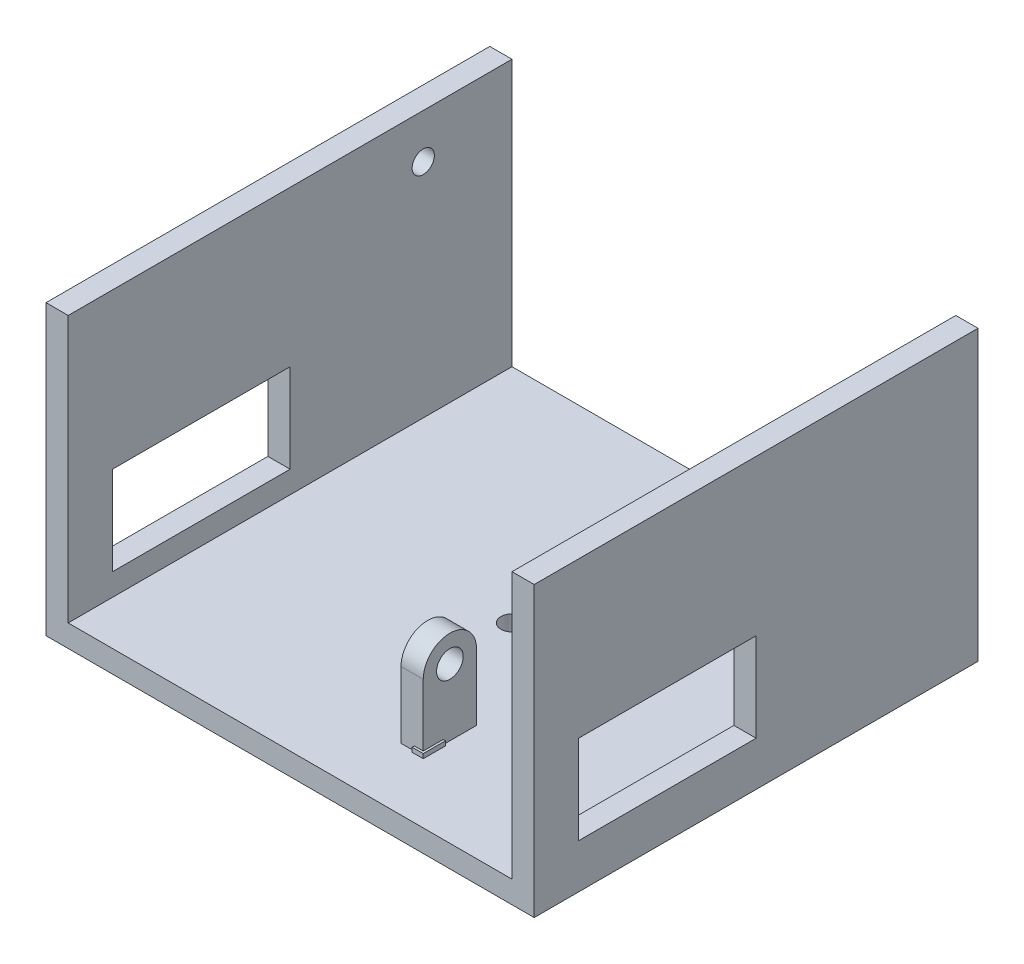
ISO-10303-21;
HEADER;
FILE_DESCRIPTION(('STEP AP214'),'2;1');
FILE_NAME('part.step','',(''),(''),'','','');
FILE_SCHEMA(('AUTOMOTIVE_DESIGN { 1 0 10303 214 1 1 1 1 }'));
ENDSEC;
DATA;
#1=APPLICATION_CONTEXT('core data for automotive mechanical design processes');
#2=APPLICATION_PROTOCOL_DEFINITION('international standard','automotive_design',2000,#1);
#3=PRODUCT_CONTEXT('',#1,'mechanical');
#4=PRODUCT('Part','Part','',(#3));
#5=PRODUCT_RELATED_PRODUCT_CATEGORY('part','',(#4));
#6=PRODUCT_DEFINITION_FORMATION('','',#4);
#7=PRODUCT_DEFINITION_CONTEXT('part definition',#1,'design');
#8=PRODUCT_DEFINITION('design','',#6,#7);
#9=PRODUCT_DEFINITION_SHAPE('','',#8);
#10=(LENGTH_UNIT() NAMED_UNIT(*) SI_UNIT(.MILLI.,.METRE.));
#11=(NAMED_UNIT(*) PLANE_ANGLE_UNIT() SI_UNIT($,.RADIAN.));
#12=(NAMED_UNIT(*) SI_UNIT($,.STERADIAN.) SOLID_ANGLE_UNIT());
#13=UNCERTAINTY_MEASURE_WITH_UNIT(LENGTH_MEASURE(1.E-05),#10,'distance_accuracy_value','');
#14=(GEOMETRIC_REPRESENTATION_CONTEXT(3) GLOBAL_UNCERTAINTY_ASSIGNED_CONTEXT((#13)) GLOBAL_UNIT_ASSIGNED_CONTEXT((#10,
#11,#12)) REPRESENTATION_CONTEXT('',''));
#15=CARTESIAN_POINT('',(0.,0.,0.));
#16=DIRECTION('',(0.,0.,1.));
#17=DIRECTION('',(1.,0.,0.));
#18=AXIS2_PLACEMENT_3D('',#15,#16,#17);
#19=CARTESIAN_POINT('',(-50.,4.99999999999999,100.));
#20=DIRECTION('',(0.,-1.,0.));
#21=DIRECTION('',(0.,0.,-1.));
#22=AXIS2_PLACEMENT_3D('',#19,#20,#21);
#23=PLANE('',#22);
#24=CARTESIAN_POINT('',(0.,4.99999999999999,50.));
#25=DIRECTION('',(0.,1.,0.));
#26=DIRECTION('',(0.,0.,1.));
#27=AXIS2_PLACEMENT_3D('',#24,#25,#26);
#28=CIRCLE('',#27,2.5);
#29=CARTESIAN_POINT('',(0.,4.99999999999999,52.5));
#30=VERTEX_POINT('',#29);
#31=EDGE_CURVE('E392',#30,#30,#28,.T.);
#32=ORIENTED_EDGE('',*,*,#31,.F.);
#33=EDGE_LOOP('',(#32));
#34=FACE_BOUND('',#33,.T.);
#35=CARTESIAN_POINT('',(0.,4.99999999999999,30.));
#36=DIRECTION('',(0.,1.,0.));
#37=DIRECTION('',(0.,0.,-1.));
#38=AXIS2_PLACEMENT_3D('',#35,#36,#37);
#39=CIRCLE('',#38,3.);
#40=CARTESIAN_POINT('',(0.,4.99999999999999,27.));
#41=VERTEX_POINT('',#40);
#42=EDGE_CURVE('E391',#41,#41,#39,.T.);
#43=ORIENTED_EDGE('',*,*,#42,.F.);
#44=EDGE_LOOP('',(#43));
#45=FACE_BOUND('',#44,.T.);
#46=DIRECTION('',(-1.,0.,0.));
#47=VECTOR('',#46,1.);
#48=CARTESIAN_POINT('',(-50.,4.99999999999999,0.));
#49=LINE('',#48,#47);
#50=CARTESIAN_POINT('',(50.,4.99999999999999,0.));
#51=VERTEX_POINT('',#50);
#52=CARTESIAN_POINT('',(-50.,4.99999999999999,0.));
#53=VERTEX_POINT('',#52);
#54=EDGE_CURVE('E437',#51,#53,#49,.T.);
#55=ORIENTED_EDGE('',*,*,#54,.T.);
#56=DIRECTION('',(0.,0.,-1.));
#57=VECTOR('',#56,1.);
#58=CARTESIAN_POINT('',(-50.,4.99999999999999,100.));
#59=LINE('',#58,#57);
#60=CARTESIAN_POINT('',(-50.,4.99999999999999,100.));
#61=VERTEX_POINT('',#60);
#62=EDGE_CURVE('E466',#61,#53,#59,.T.);
#63=ORIENTED_EDGE('',*,*,#62,.F.);
#64=DIRECTION('',(-1.,0.,0.));
#65=VECTOR('',#64,1.);
#66=CARTESIAN_POINT('',(-50.,4.99999999999999,100.));
#67=LINE('',#66,#65);
#68=CARTESIAN_POINT('',(50.,4.99999999999999,100.));
#69=VERTEX_POINT('',#68);
#70=EDGE_CURVE('E411',#69,#61,#67,.T.);
#71=ORIENTED_EDGE('',*,*,#70,.F.);
#72=DIRECTION('',(0.,0.,-1.));
#73=VECTOR('',#72,1.);
#74=CARTESIAN_POINT('',(50.,4.99999999999999,100.));
#75=LINE('',#74,#73);
#76=EDGE_CURVE('E470',#69,#51,#75,.T.);
#77=ORIENTED_EDGE('',*,*,#76,.T.);
#78=EDGE_LOOP('',(#55,#63,#71,#77));
#79=FACE_BOUND('',#78,.T.);
#80=DIRECTION('',(0.,0.,1.));
#81=VECTOR('',#80,1.);
#82=CARTESIAN_POINT('',(14.,4.99999999999999,86.));
#83=LINE('',#82,#81);
#84=CARTESIAN_POINT('',(14.,4.99999999999999,86.));
#85=VERTEX_POINT('',#84);
#86=CARTESIAN_POINT('',(14.,4.99999999999999,86.5));
#87=VERTEX_POINT('',#86);
#88=EDGE_CURVE('E238',#85,#87,#83,.T.);
#89=ORIENTED_EDGE('',*,*,#88,.F.);
#90=DIRECTION('',(1.,0.,0.));
#91=VECTOR('',#90,1.);
#92=CARTESIAN_POINT('',(11.,4.99999999999999,86.));
#93=LINE('',#92,#91);
#94=CARTESIAN_POINT('',(11.,4.99999999999999,86.));
#95=VERTEX_POINT('',#94);
#96=EDGE_CURVE('E268',#95,#85,#93,.T.);
#97=ORIENTED_EDGE('',*,*,#96,.F.);
#98=DIRECTION('',(0.,0.,1.));
#99=VECTOR('',#98,1.);
#100=CARTESIAN_POINT('',(11.,4.99999999999999,74.));
#101=LINE('',#100,#99);
#102=CARTESIAN_POINT('',(11.,4.99999999999999,74.));
#103=VERTEX_POINT('',#102);
#104=EDGE_CURVE('E279',#103,#95,#101,.T.);
#105=ORIENTED_EDGE('',*,*,#104,.F.);
#106=DIRECTION('',(-1.,0.,0.));
#107=VECTOR('',#106,1.);
#108=CARTESIAN_POINT('',(11.,4.99999999999999,74.));
#109=LINE('',#108,#107);
#110=CARTESIAN_POINT('',(16.,4.99999999999999,74.));
#111=VERTEX_POINT('',#110);
#112=EDGE_CURVE('E275',#111,#103,#109,.T.);
#113=ORIENTED_EDGE('',*,*,#112,.F.);
#114=DIRECTION('',(0.,0.,-1.));
#115=VECTOR('',#114,1.);
#116=CARTESIAN_POINT('',(16.,4.99999999999999,74.));
#117=LINE('',#116,#115);
#118=CARTESIAN_POINT('',(16.,4.99999999999999,81.5));
#119=VERTEX_POINT('',#118);
#120=EDGE_CURVE('E71',#119,#111,#117,.T.);
#121=ORIENTED_EDGE('',*,*,#120,.F.);
#122=DIRECTION('',(-1.,0.,0.));
#123=VECTOR('',#122,1.);
#124=CARTESIAN_POINT('',(16.5,4.99999999999999,81.5));
#125=LINE('',#124,#123);
#126=CARTESIAN_POINT('',(16.5,4.99999999999999,81.5));
#127=VERTEX_POINT('',#126);
#128=EDGE_CURVE('E234',#127,#119,#125,.T.);
#129=ORIENTED_EDGE('',*,*,#128,.F.);
#130=DIRECTION('',(0.,0.,-1.));
#131=VECTOR('',#130,1.);
#132=CARTESIAN_POINT('',(16.5,4.99999999999999,86.5));
#133=LINE('',#132,#131);
#134=CARTESIAN_POINT('',(16.5,4.99999999999999,86.5));
#135=VERTEX_POINT('',#134);
#136=EDGE_CURVE('E799',#135,#127,#133,.T.);
#137=ORIENTED_EDGE('',*,*,#136,.F.);
#138=DIRECTION('',(1.,0.,0.));
#139=VECTOR('',#138,1.);
#140=CARTESIAN_POINT('',(14.,4.99999999999999,86.5));
#141=LINE('',#140,#139);
#142=EDGE_CURVE('E819',#87,#135,#141,.T.);
#143=ORIENTED_EDGE('',*,*,#142,.F.);
#144=EDGE_LOOP('',(#89,#97,#105,#113,#121,#129,#137,#143));
#145=FACE_BOUND('',#144,.T.);
#146=ADVANCED_FACE('F45',(#34,#45,#79,#145),#23,.F.);
#147=CARTESIAN_POINT('',(16.,20.,74.));
#148=DIRECTION('',(-1.,0.,0.));
#149=DIRECTION('',(0.,0.,1.));
#150=AXIS2_PLACEMENT_3D('',#147,#148,#149);
#151=PLANE('',#150);
#152=CARTESIAN_POINT('',(16.,20.,80.));
#153=DIRECTION('',(-1.,0.,0.));
#154=DIRECTION('',(0.,0.,1.));
#155=AXIS2_PLACEMENT_3D('',#152,#153,#154);
#156=CIRCLE('',#155,3.00000000000001);
#157=CARTESIAN_POINT('',(16.,20.,83.));
#158=VERTEX_POINT('',#157);
#159=EDGE_CURVE('E246',#158,#158,#156,.T.);
#160=ORIENTED_EDGE('',*,*,#159,.T.);
#161=EDGE_LOOP('',(#160));
#162=FACE_BOUND('',#161,.T.);
#163=DIRECTION('',(0.,-1.,0.));
#164=VECTOR('',#163,1.);
#165=CARTESIAN_POINT('',(16.,5.99999999999999,81.5));
#166=LINE('',#165,#164);
#167=CARTESIAN_POINT('',(16.,5.99999999999999,81.5));
#168=VERTEX_POINT('',#167);
#169=EDGE_CURVE('E795',#168,#119,#166,.T.);
#170=ORIENTED_EDGE('',*,*,#169,.T.);
#171=ORIENTED_EDGE('',*,*,#120,.T.);
#172=DIRECTION('',(0.,-1.,0.));
#173=VECTOR('',#172,1.);
#174=CARTESIAN_POINT('',(16.,20.,74.));
#175=LINE('',#174,#173);
#176=CARTESIAN_POINT('',(16.,20.,74.));
#177=VERTEX_POINT('',#176);
#178=EDGE_CURVE('E297',#177,#111,#175,.T.);
#179=ORIENTED_EDGE('',*,*,#178,.F.);
#180=CARTESIAN_POINT('',(16.,20.,80.));
#181=DIRECTION('',(-1.,0.,0.));
#182=DIRECTION('',(0.,0.,1.));
#183=AXIS2_PLACEMENT_3D('',#180,#181,#182);
#184=CIRCLE('',#183,6.);
#185=CARTESIAN_POINT('',(16.,20.,86.));
#186=VERTEX_POINT('',#185);
#187=EDGE_CURVE('E256',#177,#186,#184,.F.);
#188=ORIENTED_EDGE('',*,*,#187,.T.);
#189=DIRECTION('',(0.,-1.,0.));
#190=VECTOR('',#189,1.);
#191=CARTESIAN_POINT('',(16.,20.,86.));
#192=LINE('',#191,#190);
#193=CARTESIAN_POINT('',(16.,5.99999999999999,86.));
#194=VERTEX_POINT('',#193);
#195=EDGE_CURVE('E272',#186,#194,#192,.T.);
#196=ORIENTED_EDGE('',*,*,#195,.T.);
#197=DIRECTION('',(0.,0.,1.));
#198=VECTOR('',#197,1.);
#199=CARTESIAN_POINT('',(16.,5.99999999999999,81.5));
#200=LINE('',#199,#198);
#201=EDGE_CURVE('E63',#168,#194,#200,.T.);
#202=ORIENTED_EDGE('',*,*,#201,.F.);
#203=EDGE_LOOP('',(#170,#171,#179,#188,#196,#202));
#204=FACE_BOUND('',#203,.T.);
#205=ADVANCED_FACE('F503',(#162,#204),#151,.F.);
#206=CARTESIAN_POINT('',(11.,20.,86.));
#207=DIRECTION('',(0.,0.,-1.));
#208=DIRECTION('',(-1.,0.,0.));
#209=AXIS2_PLACEMENT_3D('',#206,#207,#208);
#210=PLANE('',#209);
#211=DIRECTION('',(0.,-1.,0.));
#212=VECTOR('',#211,1.);
#213=CARTESIAN_POINT('',(14.,5.99999999999999,86.));
#214=LINE('',#213,#212);
#215=CARTESIAN_POINT('',(14.,5.99999999999999,86.));
#216=VERTEX_POINT('',#215);
#217=EDGE_CURVE('E802',#216,#85,#214,.T.);
#218=ORIENTED_EDGE('',*,*,#217,.F.);
#219=DIRECTION('',(-1.,0.,0.));
#220=VECTOR('',#219,1.);
#221=CARTESIAN_POINT('',(16.,5.99999999999999,86.));
#222=LINE('',#221,#220);
#223=EDGE_CURVE('E230',#194,#216,#222,.T.);
#224=ORIENTED_EDGE('',*,*,#223,.F.);
#225=ORIENTED_EDGE('',*,*,#195,.F.);
#226=DIRECTION('',(1.,0.,0.));
#227=VECTOR('',#226,1.);
#228=CARTESIAN_POINT('',(11.,20.,86.));
#229=LINE('',#228,#227);
#230=CARTESIAN_POINT('',(11.,20.,86.));
#231=VERTEX_POINT('',#230);
#232=EDGE_CURVE('E267',#231,#186,#229,.T.);
#233=ORIENTED_EDGE('',*,*,#232,.F.);
#234=DIRECTION('',(0.,-1.,0.));
#235=VECTOR('',#234,1.);
#236=CARTESIAN_POINT('',(11.,20.,86.));
#237=LINE('',#236,#235);
#238=EDGE_CURVE('E289',#231,#95,#237,.T.);
#239=ORIENTED_EDGE('',*,*,#238,.T.);
#240=ORIENTED_EDGE('',*,*,#96,.T.);
#241=EDGE_LOOP('',(#218,#224,#225,#233,#239,#240));
#242=FACE_BOUND('',#241,.T.);
#243=ADVANCED_FACE('F510',(#242),#210,.F.);
#244=CARTESIAN_POINT('',(55.,0.,100.));
#245=DIRECTION('',(-1.,0.,0.));
#246=DIRECTION('',(0.,-1.,0.));
#247=AXIS2_PLACEMENT_3D('',#244,#245,#246);
#248=PLANE('',#247);
#249=DIRECTION('',(0.,0.,1.));
#250=VECTOR('',#249,1.);
#251=CARTESIAN_POINT('',(55.,10.,90.));
#252=LINE('',#251,#250);
#253=CARTESIAN_POINT('',(55.,10.,50.));
#254=VERTEX_POINT('',#253);
#255=CARTESIAN_POINT('',(55.,10.,90.));
#256=VERTEX_POINT('',#255);
#257=EDGE_CURVE('E315',#254,#256,#252,.T.);
#258=ORIENTED_EDGE('',*,*,#257,.T.);
#259=DIRECTION('',(0.,1.,0.));
#260=VECTOR('',#259,1.);
#261=CARTESIAN_POINT('',(55.,10.,90.));
#262=LINE('',#261,#260);
#263=CARTESIAN_POINT('',(55.,30.,90.));
#264=VERTEX_POINT('',#263);
#265=EDGE_CURVE('E302',#256,#264,#262,.T.);
#266=ORIENTED_EDGE('',*,*,#265,.T.);
#267=DIRECTION('',(0.,0.,-1.));
#268=VECTOR('',#267,1.);
#269=CARTESIAN_POINT('',(55.,30.,90.));
#270=LINE('',#269,#268);
#271=CARTESIAN_POINT('',(55.,30.,50.));
#272=VERTEX_POINT('',#271);
#273=EDGE_CURVE('E306',#264,#272,#270,.T.);
#274=ORIENTED_EDGE('',*,*,#273,.T.);
#275=DIRECTION('',(0.,-1.,0.));
#276=VECTOR('',#275,1.);
#277=CARTESIAN_POINT('',(55.,10.,50.));
#278=LINE('',#277,#276);
#279=EDGE_CURVE('E311',#272,#254,#278,.T.);
#280=ORIENTED_EDGE('',*,*,#279,.T.);
#281=EDGE_LOOP('',(#258,#266,#274,#280));
#282=FACE_BOUND('',#281,.T.);
#283=DIRECTION('',(0.,1.,0.));
#284=VECTOR('',#283,1.);
#285=CARTESIAN_POINT('',(55.,0.,0.));
#286=LINE('',#285,#284);
#287=CARTESIAN_POINT('',(55.,0.,0.));
#288=VERTEX_POINT('',#287);
#289=CARTESIAN_POINT('',(55.,65.,0.));
#290=VERTEX_POINT('',#289);
#291=EDGE_CURVE('E427',#288,#290,#286,.T.);
#292=ORIENTED_EDGE('',*,*,#291,.T.);
#293=DIRECTION('',(0.,0.,-1.));
#294=VECTOR('',#293,1.);
#295=CARTESIAN_POINT('',(55.,65.,100.));
#296=LINE('',#295,#294);
#297=CARTESIAN_POINT('',(55.,65.,100.));
#298=VERTEX_POINT('',#297);
#299=EDGE_CURVE('E11',#298,#290,#296,.T.);
#300=ORIENTED_EDGE('',*,*,#299,.F.);
#301=DIRECTION('',(0.,1.,0.));
#302=VECTOR('',#301,1.);
#303=CARTESIAN_POINT('',(55.,0.,100.));
#304=LINE('',#303,#302);
#305=CARTESIAN_POINT('',(55.,0.,100.));
#306=VERTEX_POINT('',#305);
#307=EDGE_CURVE('E400',#306,#298,#304,.T.);
#308=ORIENTED_EDGE('',*,*,#307,.F.);
#309=DIRECTION('',(0.,0.,-1.));
#310=VECTOR('',#309,1.);
#311=CARTESIAN_POINT('',(55.,0.,100.));
#312=LINE('',#311,#310);
#313=EDGE_CURVE('E426',#306,#288,#312,.T.);
#314=ORIENTED_EDGE('',*,*,#313,.T.);
#315=EDGE_LOOP('',(#292,#300,#308,#314));
#316=FACE_BOUND('',#315,.T.);
#317=ADVANCED_FACE('F47',(#282,#316),#248,.F.);
#318=CARTESIAN_POINT('',(55.,65.,100.));
#319=DIRECTION('',(0.,-1.,0.));
#320=DIRECTION('',(0.,0.,-1.));
#321=AXIS2_PLACEMENT_3D('',#318,#319,#320);
#322=PLANE('',#321);
#323=DIRECTION('',(-1.,0.,0.));
#324=VECTOR('',#323,1.);
#325=CARTESIAN_POINT('',(55.,65.,0.));
#326=LINE('',#325,#324);
#327=CARTESIAN_POINT('',(50.,65.,0.));
#328=VERTEX_POINT('',#327);
#329=EDGE_CURVE('E431',#290,#328,#326,.T.);
#330=ORIENTED_EDGE('',*,*,#329,.T.);
#331=DIRECTION('',(0.,0.,-1.));
#332=VECTOR('',#331,1.);
#333=CARTESIAN_POINT('',(50.,65.,100.));
#334=LINE('',#333,#332);
#335=CARTESIAN_POINT('',(50.,65.,100.));
#336=VERTEX_POINT('',#335);
#337=EDGE_CURVE('E55',#336,#328,#334,.T.);
#338=ORIENTED_EDGE('',*,*,#337,.F.);
#339=DIRECTION('',(-1.,0.,0.));
#340=VECTOR('',#339,1.);
#341=CARTESIAN_POINT('',(55.,65.,100.));
#342=LINE('',#341,#340);
#343=EDGE_CURVE('E404',#298,#336,#342,.T.);
#344=ORIENTED_EDGE('',*,*,#343,.F.);
#345=ORIENTED_EDGE('',*,*,#299,.T.);
#346=EDGE_LOOP('',(#330,#338,#344,#345));
#347=FACE_BOUND('',#346,.T.);
#348=ADVANCED_FACE('F521',(#347),#322,.F.);
#349=CARTESIAN_POINT('',(50.,65.,100.));
#350=DIRECTION('',(1.,0.,0.));
#351=DIRECTION('',(0.,1.,0.));
#352=AXIS2_PLACEMENT_3D('',#349,#350,#351);
#353=PLANE('',#352);
#354=DIRECTION('',(0.,0.,1.));
#355=VECTOR('',#354,1.);
#356=CARTESIAN_POINT('',(50.,30.,100.));
#357=LINE('',#356,#355);
#358=CARTESIAN_POINT('',(50.,30.,50.));
#359=VERTEX_POINT('',#358);
#360=CARTESIAN_POINT('',(50.,30.,90.));
#361=VERTEX_POINT('',#360);
#362=EDGE_CURVE('E355',#359,#361,#357,.T.);
#363=ORIENTED_EDGE('',*,*,#362,.T.);
#364=DIRECTION('',(0.,-1.,0.));
#365=VECTOR('',#364,1.);
#366=CARTESIAN_POINT('',(50.,65.,90.));
#367=LINE('',#366,#365);
#368=CARTESIAN_POINT('',(50.,10.,90.));
#369=VERTEX_POINT('',#368);
#370=EDGE_CURVE('E379',#361,#369,#367,.T.);
#371=ORIENTED_EDGE('',*,*,#370,.T.);
#372=DIRECTION('',(0.,0.,-1.));
#373=VECTOR('',#372,1.);
#374=CARTESIAN_POINT('',(50.,10.,100.));
#375=LINE('',#374,#373);
#376=CARTESIAN_POINT('',(50.,10.,50.));
#377=VERTEX_POINT('',#376);
#378=EDGE_CURVE('E371',#369,#377,#375,.T.);
#379=ORIENTED_EDGE('',*,*,#378,.T.);
#380=DIRECTION('',(0.,1.,0.));
#381=VECTOR('',#380,1.);
#382=CARTESIAN_POINT('',(50.,65.,50.));
#383=LINE('',#382,#381);
#384=EDGE_CURVE('E363',#377,#359,#383,.T.);
#385=ORIENTED_EDGE('',*,*,#384,.T.);
#386=EDGE_LOOP('',(#363,#371,#379,#385));
#387=FACE_BOUND('',#386,.T.);
#388=DIRECTION('',(0.,-1.,0.));
#389=VECTOR('',#388,1.);
#390=CARTESIAN_POINT('',(50.,65.,0.));
#391=LINE('',#390,#389);
#392=EDGE_CURVE('E434',#328,#51,#391,.T.);
#393=ORIENTED_EDGE('',*,*,#392,.T.);
#394=ORIENTED_EDGE('',*,*,#76,.F.);
#395=DIRECTION('',(0.,-1.,0.));
#396=VECTOR('',#395,1.);
#397=CARTESIAN_POINT('',(50.,65.,100.));
#398=LINE('',#397,#396);
#399=EDGE_CURVE('E408',#336,#69,#398,.T.);
#400=ORIENTED_EDGE('',*,*,#399,.F.);
#401=ORIENTED_EDGE('',*,*,#337,.T.);
#402=EDGE_LOOP('',(#393,#394,#400,#401));
#403=FACE_BOUND('',#402,.T.);
#404=ADVANCED_FACE('F519',(#387,#403),#353,.F.);
#405=CARTESIAN_POINT('',(-50.,65.,100.));
#406=DIRECTION('',(-1.,0.,0.));
#407=DIRECTION('',(0.,-1.,0.));
#408=AXIS2_PLACEMENT_3D('',#405,#406,#407);
#409=PLANE('',#408);
#410=DIRECTION('',(0.,0.,1.));
#411=VECTOR('',#410,1.);
#412=CARTESIAN_POINT('',(-50.,10.,100.));
#413=LINE('',#412,#411);
#414=CARTESIAN_POINT('',(-50.,10.,50.));
#415=VERTEX_POINT('',#414);
#416=CARTESIAN_POINT('',(-50.,10.,90.));
#417=VERTEX_POINT('',#416);
#418=EDGE_CURVE('E367',#415,#417,#413,.T.);
#419=ORIENTED_EDGE('',*,*,#418,.T.);
#420=DIRECTION('',(0.,1.,0.));
#421=VECTOR('',#420,1.);
#422=CARTESIAN_POINT('',(-50.,65.,90.));
#423=LINE('',#422,#421);
#424=CARTESIAN_POINT('',(-50.,30.,90.));
#425=VERTEX_POINT('',#424);
#426=EDGE_CURVE('E375',#417,#425,#423,.T.);
#427=ORIENTED_EDGE('',*,*,#426,.T.);
#428=DIRECTION('',(0.,0.,-1.));
#429=VECTOR('',#428,1.);
#430=CARTESIAN_POINT('',(-50.,30.,100.));
#431=LINE('',#430,#429);
#432=CARTESIAN_POINT('',(-50.,30.,50.));
#433=VERTEX_POINT('',#432);
#434=EDGE_CURVE('E337',#425,#433,#431,.T.);
#435=ORIENTED_EDGE('',*,*,#434,.T.);
#436=DIRECTION('',(0.,-1.,0.));
#437=VECTOR('',#436,1.);
#438=CARTESIAN_POINT('',(-50.,65.,50.));
#439=LINE('',#438,#437);
#440=EDGE_CURVE('E359',#433,#415,#439,.T.);
#441=ORIENTED_EDGE('',*,*,#440,.T.);
#442=EDGE_LOOP('',(#419,#427,#435,#441));
#443=FACE_BOUND('',#442,.T.);
#444=CARTESIAN_POINT('',(-50.,55.,20.));
#445=DIRECTION('',(-1.,0.,0.));
#446=DIRECTION('',(0.,-1.,0.));
#447=AXIS2_PLACEMENT_3D('',#444,#445,#446);
#448=CIRCLE('',#447,2.5);
#449=CARTESIAN_POINT('',(-50.,52.5,20.));
#450=VERTEX_POINT('',#449);
#451=EDGE_CURVE('E387',#450,#450,#448,.T.);
#452=ORIENTED_EDGE('',*,*,#451,.T.);
#453=EDGE_LOOP('',(#452));
#454=FACE_BOUND('',#453,.T.);
#455=DIRECTION('',(0.,1.,0.));
#456=VECTOR('',#455,1.);
#457=CARTESIAN_POINT('',(-50.,65.,0.));
#458=LINE('',#457,#456);
#459=CARTESIAN_POINT('',(-50.,65.,0.));
#460=VERTEX_POINT('',#459);
#461=EDGE_CURVE('E440',#53,#460,#458,.T.);
#462=ORIENTED_EDGE('',*,*,#461,.T.);
#463=DIRECTION('',(0.,0.,-1.));
#464=VECTOR('',#463,1.);
#465=CARTESIAN_POINT('',(-50.,65.,100.));
#466=LINE('',#465,#464);
#467=CARTESIAN_POINT('',(-50.,65.,100.));
#468=VERTEX_POINT('',#467);
#469=EDGE_CURVE('E462',#468,#460,#466,.T.);
#470=ORIENTED_EDGE('',*,*,#469,.F.);
#471=DIRECTION('',(0.,1.,0.));
#472=VECTOR('',#471,1.);
#473=CARTESIAN_POINT('',(-50.,65.,100.));
#474=LINE('',#473,#472);
#475=EDGE_CURVE('E414',#61,#468,#474,.T.);
#476=ORIENTED_EDGE('',*,*,#475,.F.);
#477=ORIENTED_EDGE('',*,*,#62,.T.);
#478=EDGE_LOOP('',(#462,#470,#476,#477));
#479=FACE_BOUND('',#478,.T.);
#480=ADVANCED_FACE('F517',(#443,#454,#479),#409,.F.);
#481=CARTESIAN_POINT('',(-55.,65.,100.));
#482=DIRECTION('',(0.,-1.,0.));
#483=DIRECTION('',(0.,0.,-1.));
#484=AXIS2_PLACEMENT_3D('',#481,#482,#483);
#485=PLANE('',#484);
#486=DIRECTION('',(-1.,0.,0.));
#487=VECTOR('',#486,1.);
#488=CARTESIAN_POINT('',(-55.,65.,0.));
#489=LINE('',#488,#487);
#490=CARTESIAN_POINT('',(-55.,65.,0.));
#491=VERTEX_POINT('',#490);
#492=EDGE_CURVE('E443',#460,#491,#489,.T.);
#493=ORIENTED_EDGE('',*,*,#492,.T.);
#494=DIRECTION('',(0.,0.,-1.));
#495=VECTOR('',#494,1.);
#496=CARTESIAN_POINT('',(-55.,65.,100.));
#497=LINE('',#496,#495);
#498=CARTESIAN_POINT('',(-55.,65.,100.));
#499=VERTEX_POINT('',#498);
#500=EDGE_CURVE('E458',#499,#491,#497,.T.);
#501=ORIENTED_EDGE('',*,*,#500,.F.);
#502=DIRECTION('',(-1.,0.,0.));
#503=VECTOR('',#502,1.);
#504=CARTESIAN_POINT('',(-55.,65.,100.));
#505=LINE('',#504,#503);
#506=EDGE_CURVE('E417',#468,#499,#505,.T.);
#507=ORIENTED_EDGE('',*,*,#506,.F.);
#508=ORIENTED_EDGE('',*,*,#469,.T.);
#509=EDGE_LOOP('',(#493,#501,#507,#508));
#510=FACE_BOUND('',#509,.T.);
#511=ADVANCED_FACE('F564',(#510),#485,.F.);
#512=CARTESIAN_POINT('',(-55.,0.,100.));
#513=DIRECTION('',(1.,0.,0.));
#514=DIRECTION('',(0.,1.,0.));
#515=AXIS2_PLACEMENT_3D('',#512,#513,#514);
#516=PLANE('',#515);
#517=DIRECTION('',(0.,0.,-1.));
#518=VECTOR('',#517,1.);
#519=CARTESIAN_POINT('',(-55.,30.,90.));
#520=LINE('',#519,#518);
#521=CARTESIAN_POINT('',(-55.,30.,90.));
#522=VERTEX_POINT('',#521);
#523=CARTESIAN_POINT('',(-55.,30.,50.));
#524=VERTEX_POINT('',#523);
#525=EDGE_CURVE('E322',#522,#524,#520,.T.);
#526=ORIENTED_EDGE('',*,*,#525,.F.);
#527=DIRECTION('',(0.,1.,0.));
#528=VECTOR('',#527,1.);
#529=CARTESIAN_POINT('',(-55.,10.,90.));
#530=LINE('',#529,#528);
#531=CARTESIAN_POINT('',(-55.,10.,90.));
#532=VERTEX_POINT('',#531);
#533=EDGE_CURVE('E301',#532,#522,#530,.T.);
#534=ORIENTED_EDGE('',*,*,#533,.F.);
#535=DIRECTION('',(0.,0.,1.));
#536=VECTOR('',#535,1.);
#537=CARTESIAN_POINT('',(-55.,10.,90.));
#538=LINE('',#537,#536);
#539=CARTESIAN_POINT('',(-55.,9.99999999999999,50.));
#540=VERTEX_POINT('',#539);
#541=EDGE_CURVE('E307',#540,#532,#538,.T.);
#542=ORIENTED_EDGE('',*,*,#541,.F.);
#543=DIRECTION('',(0.,-1.,0.));
#544=VECTOR('',#543,1.);
#545=CARTESIAN_POINT('',(-55.,9.99999999999999,50.));
#546=LINE('',#545,#544);
#547=EDGE_CURVE('E326',#524,#540,#546,.T.);
#548=ORIENTED_EDGE('',*,*,#547,.F.);
#549=EDGE_LOOP('',(#526,#534,#542,#548));
#550=FACE_BOUND('',#549,.T.);
#551=CARTESIAN_POINT('',(-55.,55.,20.));
#552=DIRECTION('',(-1.,0.,0.));
#553=DIRECTION('',(0.,0.,1.));
#554=AXIS2_PLACEMENT_3D('',#551,#552,#553);
#555=CIRCLE('',#554,2.5);
#556=CARTESIAN_POINT('',(-55.,55.,22.5));
#557=VERTEX_POINT('',#556);
#558=EDGE_CURVE('E383',#557,#557,#555,.T.);
#559=ORIENTED_EDGE('',*,*,#558,.F.);
#560=EDGE_LOOP('',(#559));
#561=FACE_BOUND('',#560,.T.);
#562=DIRECTION('',(0.,-1.,0.));
#563=VECTOR('',#562,1.);
#564=CARTESIAN_POINT('',(-55.,0.,0.));
#565=LINE('',#564,#563);
#566=CARTESIAN_POINT('',(-55.,0.,0.));
#567=VERTEX_POINT('',#566);
#568=EDGE_CURVE('E446',#491,#567,#565,.T.);
#569=ORIENTED_EDGE('',*,*,#568,.T.);
#570=DIRECTION('',(0.,0.,-1.));
#571=VECTOR('',#570,1.);
#572=CARTESIAN_POINT('',(-55.,0.,100.));
#573=LINE('',#572,#571);
#574=CARTESIAN_POINT('',(-55.,0.,100.));
#575=VERTEX_POINT('',#574);
#576=EDGE_CURVE('E454',#575,#567,#573,.T.);
#577=ORIENTED_EDGE('',*,*,#576,.F.);
#578=DIRECTION('',(0.,-1.,0.));
#579=VECTOR('',#578,1.);
#580=CARTESIAN_POINT('',(-55.,0.,100.));
#581=LINE('',#580,#579);
#582=EDGE_CURVE('E420',#499,#575,#581,.T.);
#583=ORIENTED_EDGE('',*,*,#582,.F.);
#584=ORIENTED_EDGE('',*,*,#500,.T.);
#585=EDGE_LOOP('',(#569,#577,#583,#584));
#586=FACE_BOUND('',#585,.T.);
#587=ADVANCED_FACE('F562',(#550,#561,#586),#516,.F.);
#588=CARTESIAN_POINT('',(55.,0.,100.));
#589=DIRECTION('',(0.,1.,0.));
#590=DIRECTION('',(-1.,0.,0.));
#591=AXIS2_PLACEMENT_3D('',#588,#589,#590);
#592=PLANE('',#591);
#593=CARTESIAN_POINT('',(0.,0.,50.));
#594=DIRECTION('',(0.,1.,0.));
#595=DIRECTION('',(-1.,0.,0.));
#596=AXIS2_PLACEMENT_3D('',#593,#594,#595);
#597=CIRCLE('',#596,2.5);
#598=CARTESIAN_POINT('',(-2.5,0.,50.));
#599=VERTEX_POINT('',#598);
#600=EDGE_CURVE('E49',#599,#599,#597,.T.);
#601=ORIENTED_EDGE('',*,*,#600,.T.);
#602=EDGE_LOOP('',(#601));
#603=FACE_BOUND('',#602,.T.);
#604=CARTESIAN_POINT('',(0.,0.,30.));
#605=DIRECTION('',(0.,1.,0.));
#606=DIRECTION('',(-1.,0.,0.));
#607=AXIS2_PLACEMENT_3D('',#604,#605,#606);
#608=CIRCLE('',#607,3.);
#609=CARTESIAN_POINT('',(-3.,0.,30.));
#610=VERTEX_POINT('',#609);
#611=EDGE_CURVE('E396',#610,#610,#608,.T.);
#612=ORIENTED_EDGE('',*,*,#611,.T.);
#613=EDGE_LOOP('',(#612));
#614=FACE_BOUND('',#613,.T.);
#615=DIRECTION('',(1.,0.,0.));
#616=VECTOR('',#615,1.);
#617=CARTESIAN_POINT('',(55.,0.,0.));
#618=LINE('',#617,#616);
#619=EDGE_CURVE('E405',#567,#288,#618,.T.);
#620=ORIENTED_EDGE('',*,*,#619,.T.);
#621=ORIENTED_EDGE('',*,*,#313,.F.);
#622=DIRECTION('',(1.,0.,0.));
#623=VECTOR('',#622,1.);
#624=CARTESIAN_POINT('',(55.,0.,100.));
#625=LINE('',#624,#623);
#626=EDGE_CURVE('E423',#575,#306,#625,.T.);
#627=ORIENTED_EDGE('',*,*,#626,.F.);
#628=ORIENTED_EDGE('',*,*,#576,.T.);
#629=EDGE_LOOP('',(#620,#621,#627,#628));
#630=FACE_BOUND('',#629,.T.);
#631=ADVANCED_FACE('F484',(#603,#614,#630),#592,.F.);
#632=CARTESIAN_POINT('',(0.,0.,100.));
#633=DIRECTION('',(0.,0.,1.));
#634=DIRECTION('',(1.,0.,0.));
#635=AXIS2_PLACEMENT_3D('',#632,#633,#634);
#636=PLANE('',#635);
#637=ORIENTED_EDGE('',*,*,#307,.T.);
#638=ORIENTED_EDGE('',*,*,#343,.T.);
#639=ORIENTED_EDGE('',*,*,#399,.T.);
#640=ORIENTED_EDGE('',*,*,#70,.T.);
#641=ORIENTED_EDGE('',*,*,#475,.T.);
#642=ORIENTED_EDGE('',*,*,#506,.T.);
#643=ORIENTED_EDGE('',*,*,#582,.T.);
#644=ORIENTED_EDGE('',*,*,#626,.T.);
#645=EDGE_LOOP('',(#637,#638,#639,#640,#641,#642,#643,#644));
#646=FACE_BOUND('',#645,.T.);
#647=ADVANCED_FACE('F550',(#646),#636,.T.);
#648=CARTESIAN_POINT('',(0.,0.,0.));
#649=DIRECTION('',(0.,0.,1.));
#650=DIRECTION('',(1.,0.,0.));
#651=AXIS2_PLACEMENT_3D('',#648,#649,#650);
#652=PLANE('',#651);
#653=ORIENTED_EDGE('',*,*,#291,.F.);
#654=ORIENTED_EDGE('',*,*,#619,.F.);
#655=ORIENTED_EDGE('',*,*,#568,.F.);
#656=ORIENTED_EDGE('',*,*,#492,.F.);
#657=ORIENTED_EDGE('',*,*,#461,.F.);
#658=ORIENTED_EDGE('',*,*,#54,.F.);
#659=ORIENTED_EDGE('',*,*,#392,.F.);
#660=ORIENTED_EDGE('',*,*,#329,.F.);
#661=EDGE_LOOP('',(#653,#654,#655,#656,#657,#658,#659,#660));
#662=FACE_BOUND('',#661,.T.);
#663=ADVANCED_FACE('F499',(#662),#652,.F.);
#664=CARTESIAN_POINT('',(0.,-5.00000000000001,30.));
#665=DIRECTION('',(0.,1.,0.));
#666=DIRECTION('',(0.,0.,1.));
#667=AXIS2_PLACEMENT_3D('',#664,#665,#666);
#668=CYLINDRICAL_SURFACE('',#667,3.);
#669=ORIENTED_EDGE('',*,*,#42,.T.);
#670=EDGE_LOOP('',(#669));
#671=FACE_BOUND('',#670,.T.);
#672=ORIENTED_EDGE('',*,*,#611,.F.);
#673=EDGE_LOOP('',(#672));
#674=FACE_BOUND('',#673,.T.);
#675=ADVANCED_FACE('F489',(#671,#674),#668,.F.);
#676=CARTESIAN_POINT('',(0.,-5.00000000000001,50.));
#677=DIRECTION('',(0.,1.,0.));
#678=DIRECTION('',(0.,0.,1.));
#679=AXIS2_PLACEMENT_3D('',#676,#677,#678);
#680=CYLINDRICAL_SURFACE('',#679,2.5);
#681=ORIENTED_EDGE('',*,*,#31,.T.);
#682=EDGE_LOOP('',(#681));
#683=FACE_BOUND('',#682,.T.);
#684=ORIENTED_EDGE('',*,*,#600,.F.);
#685=EDGE_LOOP('',(#684));
#686=FACE_BOUND('',#685,.T.);
#687=ADVANCED_FACE('F486',(#683,#686),#680,.F.);
#688=CARTESIAN_POINT('',(-45.,55.,20.));
#689=DIRECTION('',(-1.,0.,0.));
#690=DIRECTION('',(0.,0.,1.));
#691=AXIS2_PLACEMENT_3D('',#688,#689,#690);
#692=CYLINDRICAL_SURFACE('',#691,2.5);
#693=ORIENTED_EDGE('',*,*,#558,.T.);
#694=EDGE_LOOP('',(#693));
#695=FACE_BOUND('',#694,.T.);
#696=ORIENTED_EDGE('',*,*,#451,.F.);
#697=EDGE_LOOP('',(#696));
#698=FACE_BOUND('',#697,.T.);
#699=ADVANCED_FACE('F488',(#695,#698),#692,.F.);
#700=CARTESIAN_POINT('',(55.,30.,90.));
#701=DIRECTION('',(0.,1.,0.));
#702=DIRECTION('',(-1.,0.,0.));
#703=AXIS2_PLACEMENT_3D('',#700,#701,#702);
#704=PLANE('',#703);
#705=DIRECTION('',(-1.,0.,0.));
#706=VECTOR('',#705,1.);
#707=CARTESIAN_POINT('',(55.,30.,90.));
#708=LINE('',#707,#706);
#709=EDGE_CURVE('E319',#425,#522,#708,.T.);
#710=ORIENTED_EDGE('',*,*,#709,.T.);
#711=ORIENTED_EDGE('',*,*,#525,.T.);
#712=DIRECTION('',(-1.,0.,0.));
#713=VECTOR('',#712,1.);
#714=CARTESIAN_POINT('',(55.,30.,50.));
#715=LINE('',#714,#713);
#716=EDGE_CURVE('E348',#433,#524,#715,.T.);
#717=ORIENTED_EDGE('',*,*,#716,.F.);
#718=ORIENTED_EDGE('',*,*,#434,.F.);
#719=EDGE_LOOP('',(#710,#711,#717,#718));
#720=FACE_BOUND('',#719,.T.);
#721=ADVANCED_FACE('F496',(#720),#704,.F.);
#722=CARTESIAN_POINT('',(55.,10.,50.));
#723=DIRECTION('',(0.,0.,-1.));
#724=DIRECTION('',(-1.,0.,0.));
#725=AXIS2_PLACEMENT_3D('',#722,#723,#724);
#726=PLANE('',#725);
#727=ORIENTED_EDGE('',*,*,#716,.T.);
#728=ORIENTED_EDGE('',*,*,#547,.T.);
#729=DIRECTION('',(-1.,0.,0.));
#730=VECTOR('',#729,1.);
#731=CARTESIAN_POINT('',(55.,10.,50.));
#732=LINE('',#731,#730);
#733=EDGE_CURVE('E343',#415,#540,#732,.T.);
#734=ORIENTED_EDGE('',*,*,#733,.F.);
#735=ORIENTED_EDGE('',*,*,#440,.F.);
#736=EDGE_LOOP('',(#727,#728,#734,#735));
#737=FACE_BOUND('',#736,.T.);
#738=ADVANCED_FACE('F616',(#737),#726,.F.);
#739=CARTESIAN_POINT('',(55.,10.,90.));
#740=DIRECTION('',(0.,-1.,0.));
#741=DIRECTION('',(1.,0.,0.));
#742=AXIS2_PLACEMENT_3D('',#739,#740,#741);
#743=PLANE('',#742);
#744=ORIENTED_EDGE('',*,*,#733,.T.);
#745=ORIENTED_EDGE('',*,*,#541,.T.);
#746=DIRECTION('',(-1.,0.,0.));
#747=VECTOR('',#746,1.);
#748=CARTESIAN_POINT('',(55.,10.,90.));
#749=LINE('',#748,#747);
#750=EDGE_CURVE('E338',#417,#532,#749,.T.);
#751=ORIENTED_EDGE('',*,*,#750,.F.);
#752=ORIENTED_EDGE('',*,*,#418,.F.);
#753=EDGE_LOOP('',(#744,#745,#751,#752));
#754=FACE_BOUND('',#753,.T.);
#755=ADVANCED_FACE('F627',(#754),#743,.F.);
#756=CARTESIAN_POINT('',(55.,10.,90.));
#757=DIRECTION('',(0.,0.,1.));
#758=DIRECTION('',(1.,0.,0.));
#759=AXIS2_PLACEMENT_3D('',#756,#757,#758);
#760=PLANE('',#759);
#761=ORIENTED_EDGE('',*,*,#750,.T.);
#762=ORIENTED_EDGE('',*,*,#533,.T.);
#763=ORIENTED_EDGE('',*,*,#709,.F.);
#764=ORIENTED_EDGE('',*,*,#426,.F.);
#765=EDGE_LOOP('',(#761,#762,#763,#764));
#766=FACE_BOUND('',#765,.T.);
#767=ADVANCED_FACE('F638',(#766),#760,.F.);
#768=EDGE_CURVE('E349',#264,#361,#708,.T.);
#769=ORIENTED_EDGE('',*,*,#768,.F.);
#770=ORIENTED_EDGE('',*,*,#265,.F.);
#771=EDGE_CURVE('E333',#256,#369,#749,.T.);
#772=ORIENTED_EDGE('',*,*,#771,.T.);
#773=ORIENTED_EDGE('',*,*,#370,.F.);
#774=EDGE_LOOP('',(#769,#770,#772,#773));
#775=FACE_BOUND('',#774,.T.);
#776=ADVANCED_FACE('F649',(#775),#760,.F.);
#777=ORIENTED_EDGE('',*,*,#771,.F.);
#778=ORIENTED_EDGE('',*,*,#257,.F.);
#779=EDGE_CURVE('E339',#254,#377,#732,.T.);
#780=ORIENTED_EDGE('',*,*,#779,.T.);
#781=ORIENTED_EDGE('',*,*,#378,.F.);
#782=EDGE_LOOP('',(#777,#778,#780,#781));
#783=FACE_BOUND('',#782,.T.);
#784=ADVANCED_FACE('F641',(#783),#743,.F.);
#785=ORIENTED_EDGE('',*,*,#779,.F.);
#786=ORIENTED_EDGE('',*,*,#279,.F.);
#787=EDGE_CURVE('E344',#272,#359,#715,.T.);
#788=ORIENTED_EDGE('',*,*,#787,.T.);
#789=ORIENTED_EDGE('',*,*,#384,.F.);
#790=EDGE_LOOP('',(#785,#786,#788,#789));
#791=FACE_BOUND('',#790,.T.);
#792=ADVANCED_FACE('F630',(#791),#726,.F.);
#793=ORIENTED_EDGE('',*,*,#787,.F.);
#794=ORIENTED_EDGE('',*,*,#273,.F.);
#795=ORIENTED_EDGE('',*,*,#768,.T.);
#796=ORIENTED_EDGE('',*,*,#362,.F.);
#797=EDGE_LOOP('',(#793,#794,#795,#796));
#798=FACE_BOUND('',#797,.T.);
#799=ADVANCED_FACE('F619',(#798),#704,.F.);
#800=CARTESIAN_POINT('',(11.,20.,74.));
#801=DIRECTION('',(0.,0.,1.));
#802=DIRECTION('',(1.,0.,0.));
#803=AXIS2_PLACEMENT_3D('',#800,#801,#802);
#804=PLANE('',#803);
#805=ORIENTED_EDGE('',*,*,#112,.T.);
#806=DIRECTION('',(0.,-1.,0.));
#807=VECTOR('',#806,1.);
#808=CARTESIAN_POINT('',(11.,20.,74.));
#809=LINE('',#808,#807);
#810=CARTESIAN_POINT('',(11.,20.,74.));
#811=VERTEX_POINT('',#810);
#812=EDGE_CURVE('E293',#811,#103,#809,.T.);
#813=ORIENTED_EDGE('',*,*,#812,.F.);
#814=DIRECTION('',(-1.,0.,0.));
#815=VECTOR('',#814,1.);
#816=CARTESIAN_POINT('',(11.,20.,74.));
#817=LINE('',#816,#815);
#818=EDGE_CURVE('E263',#177,#811,#817,.T.);
#819=ORIENTED_EDGE('',*,*,#818,.F.);
#820=ORIENTED_EDGE('',*,*,#178,.T.);
#821=EDGE_LOOP('',(#805,#813,#819,#820));
#822=FACE_BOUND('',#821,.T.);
#823=ADVANCED_FACE('F683',(#822),#804,.F.);
#824=CARTESIAN_POINT('',(11.,20.,74.));
#825=DIRECTION('',(1.,0.,0.));
#826=DIRECTION('',(0.,0.,-1.));
#827=AXIS2_PLACEMENT_3D('',#824,#825,#826);
#828=PLANE('',#827);
#829=CARTESIAN_POINT('',(11.,20.,80.));
#830=DIRECTION('',(-1.,0.,0.));
#831=DIRECTION('',(0.,0.,1.));
#832=AXIS2_PLACEMENT_3D('',#829,#830,#831);
#833=CIRCLE('',#832,3.00000000000001);
#834=CARTESIAN_POINT('',(11.,20.,83.));
#835=VERTEX_POINT('',#834);
#836=EDGE_CURVE('E241',#835,#835,#833,.T.);
#837=ORIENTED_EDGE('',*,*,#836,.F.);
#838=EDGE_LOOP('',(#837));
#839=FACE_BOUND('',#838,.T.);
#840=ORIENTED_EDGE('',*,*,#104,.T.);
#841=ORIENTED_EDGE('',*,*,#238,.F.);
#842=CARTESIAN_POINT('',(11.,20.,80.));
#843=DIRECTION('',(-1.,0.,0.));
#844=DIRECTION('',(0.,0.,-1.));
#845=AXIS2_PLACEMENT_3D('',#842,#843,#844);
#846=CIRCLE('',#845,6.);
#847=EDGE_CURVE('E255',#231,#811,#846,.T.);
#848=ORIENTED_EDGE('',*,*,#847,.T.);
#849=ORIENTED_EDGE('',*,*,#812,.T.);
#850=EDGE_LOOP('',(#840,#841,#848,#849));
#851=FACE_BOUND('',#850,.T.);
#852=ADVANCED_FACE('F692',(#839,#851),#828,.F.);
#853=CARTESIAN_POINT('',(29.4164078649988,20.,80.));
#854=DIRECTION('',(-1.,0.,0.));
#855=DIRECTION('',(0.,0.,1.));
#856=AXIS2_PLACEMENT_3D('',#853,#854,#855);
#857=CYLINDRICAL_SURFACE('',#856,6.);
#858=ORIENTED_EDGE('',*,*,#187,.F.);
#859=ORIENTED_EDGE('',*,*,#818,.T.);
#860=ORIENTED_EDGE('',*,*,#847,.F.);
#861=ORIENTED_EDGE('',*,*,#232,.T.);
#862=EDGE_LOOP('',(#858,#859,#860,#861));
#863=FACE_BOUND('',#862,.T.);
#864=ADVANCED_FACE('F703',(#863),#857,.T.);
#865=CARTESIAN_POINT('',(18.,20.,80.));
#866=DIRECTION('',(-1.,0.,0.));
#867=DIRECTION('',(0.,0.,1.));
#868=AXIS2_PLACEMENT_3D('',#865,#866,#867);
#869=CYLINDRICAL_SURFACE('',#868,3.00000000000001);
#870=ORIENTED_EDGE('',*,*,#836,.T.);
#871=EDGE_LOOP('',(#870));
#872=FACE_BOUND('',#871,.T.);
#873=ORIENTED_EDGE('',*,*,#159,.F.);
#874=EDGE_LOOP('',(#873));
#875=FACE_BOUND('',#874,.T.);
#876=ADVANCED_FACE('F715',(#872,#875),#869,.F.);
#877=CARTESIAN_POINT('',(14.,5.99999999999999,86.));
#878=DIRECTION('',(1.,0.,0.));
#879=DIRECTION('',(0.,0.,-1.));
#880=AXIS2_PLACEMENT_3D('',#877,#878,#879);
#881=PLANE('',#880);
#882=ORIENTED_EDGE('',*,*,#88,.T.);
#883=DIRECTION('',(0.,-1.,0.));
#884=VECTOR('',#883,1.);
#885=CARTESIAN_POINT('',(14.,5.99999999999999,86.5));
#886=LINE('',#885,#884);
#887=CARTESIAN_POINT('',(14.,5.99999999999999,86.5));
#888=VERTEX_POINT('',#887);
#889=EDGE_CURVE('E219',#888,#87,#886,.T.);
#890=ORIENTED_EDGE('',*,*,#889,.F.);
#891=DIRECTION('',(0.,0.,1.));
#892=VECTOR('',#891,1.);
#893=CARTESIAN_POINT('',(14.,5.99999999999999,86.));
#894=LINE('',#893,#892);
#895=EDGE_CURVE('E226',#216,#888,#894,.T.);
#896=ORIENTED_EDGE('',*,*,#895,.F.);
#897=ORIENTED_EDGE('',*,*,#217,.T.);
#898=EDGE_LOOP('',(#882,#890,#896,#897));
#899=FACE_BOUND('',#898,.T.);
#900=ADVANCED_FACE('F236',(#899),#881,.F.);
#901=CARTESIAN_POINT('',(14.,5.99999999999999,86.5));
#902=DIRECTION('',(0.,0.,-1.));
#903=DIRECTION('',(-1.,0.,0.));
#904=AXIS2_PLACEMENT_3D('',#901,#902,#903);
#905=PLANE('',#904);
#906=ORIENTED_EDGE('',*,*,#142,.T.);
#907=DIRECTION('',(0.,-1.,0.));
#908=VECTOR('',#907,1.);
#909=CARTESIAN_POINT('',(16.5,5.99999999999999,86.5));
#910=LINE('',#909,#908);
#911=CARTESIAN_POINT('',(16.5,5.99999999999999,86.5));
#912=VERTEX_POINT('',#911);
#913=EDGE_CURVE('E222',#912,#135,#910,.T.);
#914=ORIENTED_EDGE('',*,*,#913,.F.);
#915=DIRECTION('',(1.,0.,0.));
#916=VECTOR('',#915,1.);
#917=CARTESIAN_POINT('',(14.,5.99999999999999,86.5));
#918=LINE('',#917,#916);
#919=EDGE_CURVE('E215',#888,#912,#918,.T.);
#920=ORIENTED_EDGE('',*,*,#919,.F.);
#921=ORIENTED_EDGE('',*,*,#889,.T.);
#922=EDGE_LOOP('',(#906,#914,#920,#921));
#923=FACE_BOUND('',#922,.T.);
#924=ADVANCED_FACE('F217',(#923),#905,.F.);
#925=CARTESIAN_POINT('',(16.5,5.99999999999999,86.5));
#926=DIRECTION('',(-1.,0.,0.));
#927=DIRECTION('',(0.,0.,1.));
#928=AXIS2_PLACEMENT_3D('',#925,#926,#927);
#929=PLANE('',#928);
#930=ORIENTED_EDGE('',*,*,#136,.T.);
#931=DIRECTION('',(0.,-1.,0.));
#932=VECTOR('',#931,1.);
#933=CARTESIAN_POINT('',(16.5,5.99999999999999,81.5));
#934=LINE('',#933,#932);
#935=CARTESIAN_POINT('',(16.5,5.99999999999999,81.5));
#936=VERTEX_POINT('',#935);
#937=EDGE_CURVE('E248',#936,#127,#934,.T.);
#938=ORIENTED_EDGE('',*,*,#937,.F.);
#939=DIRECTION('',(0.,0.,-1.));
#940=VECTOR('',#939,1.);
#941=CARTESIAN_POINT('',(16.5,5.99999999999999,86.5));
#942=LINE('',#941,#940);
#943=EDGE_CURVE('E225',#912,#936,#942,.T.);
#944=ORIENTED_EDGE('',*,*,#943,.F.);
#945=ORIENTED_EDGE('',*,*,#913,.T.);
#946=EDGE_LOOP('',(#930,#938,#944,#945));
#947=FACE_BOUND('',#946,.T.);
#948=ADVANCED_FACE('F761',(#947),#929,.F.);
#949=CARTESIAN_POINT('',(16.5,5.99999999999999,81.5));
#950=DIRECTION('',(0.,0.,1.));
#951=DIRECTION('',(1.,0.,0.));
#952=AXIS2_PLACEMENT_3D('',#949,#950,#951);
#953=PLANE('',#952);
#954=ORIENTED_EDGE('',*,*,#128,.T.);
#955=ORIENTED_EDGE('',*,*,#169,.F.);
#956=DIRECTION('',(-1.,0.,0.));
#957=VECTOR('',#956,1.);
#958=CARTESIAN_POINT('',(16.5,5.99999999999999,81.5));
#959=LINE('',#958,#957);
#960=EDGE_CURVE('E813',#936,#168,#959,.T.);
#961=ORIENTED_EDGE('',*,*,#960,.F.);
#962=ORIENTED_EDGE('',*,*,#937,.T.);
#963=EDGE_LOOP('',(#954,#955,#961,#962));
#964=FACE_BOUND('',#963,.T.);
#965=ADVANCED_FACE('F770',(#964),#953,.F.);
#966=CARTESIAN_POINT('',(0.,5.99999999999999,0.));
#967=DIRECTION('',(0.,1.,0.));
#968=DIRECTION('',(0.,0.,1.));
#969=AXIS2_PLACEMENT_3D('',#966,#967,#968);
#970=PLANE('',#969);
#971=ORIENTED_EDGE('',*,*,#895,.T.);
#972=ORIENTED_EDGE('',*,*,#919,.T.);
#973=ORIENTED_EDGE('',*,*,#943,.T.);
#974=ORIENTED_EDGE('',*,*,#960,.T.);
#975=ORIENTED_EDGE('',*,*,#201,.T.);
#976=ORIENTED_EDGE('',*,*,#223,.T.);
#977=EDGE_LOOP('',(#971,#972,#973,#974,#975,#976));
#978=FACE_BOUND('',#977,.T.);
#979=ADVANCED_FACE('F229',(#978),#970,.T.);
#980=CLOSED_SHELL('',(#146,#205,#243,#317,#348,#404,#480,#511,#587,#631,#647,#663,#675,#687,
#699,#721,#738,#755,#767,#776,#784,#792,#799,#823,#852,#864,#876,#900,#924,#948,#965,#979));
#981=MANIFOLD_SOLID_BREP('B2',#980);
#982=ADVANCED_BREP_SHAPE_REPRESENTATION('',(#18,#981),#14);
#983=SHAPE_DEFINITION_REPRESENTATION(#9,#982);
ENDSEC;
END-ISO-10303-21;
